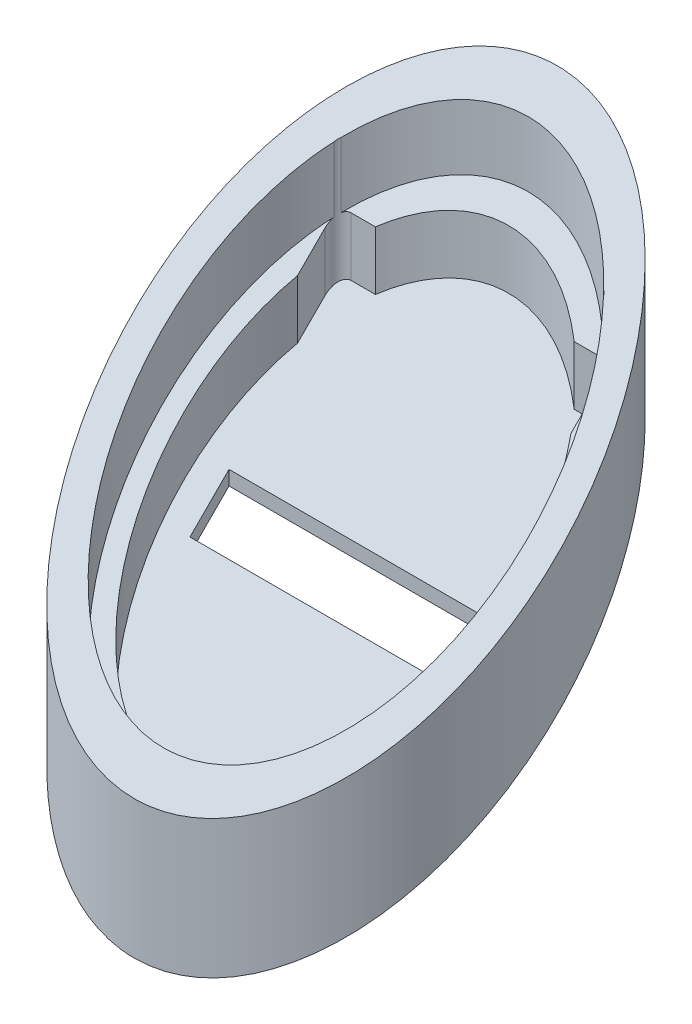
ISO-10303-21;
HEADER;
FILE_DESCRIPTION(('STEP AP214'),'2;1');
FILE_NAME('part.step','',(''),(''),'','','');
FILE_SCHEMA(('AUTOMOTIVE_DESIGN { 1 0 10303 214 1 1 1 1 }'));
ENDSEC;
DATA;
#1=APPLICATION_CONTEXT('core data for automotive mechanical design processes');
#2=APPLICATION_PROTOCOL_DEFINITION('international standard','automotive_design',2000,#1);
#3=PRODUCT_CONTEXT('',#1,'mechanical');
#4=PRODUCT('Part','Part','',(#3));
#5=PRODUCT_RELATED_PRODUCT_CATEGORY('part','',(#4));
#6=PRODUCT_DEFINITION_FORMATION('','',#4);
#7=PRODUCT_DEFINITION_CONTEXT('part definition',#1,'design');
#8=PRODUCT_DEFINITION('design','',#6,#7);
#9=PRODUCT_DEFINITION_SHAPE('','',#8);
#10=(LENGTH_UNIT() NAMED_UNIT(*) SI_UNIT(.MILLI.,.METRE.));
#11=(NAMED_UNIT(*) PLANE_ANGLE_UNIT() SI_UNIT($,.RADIAN.));
#12=(NAMED_UNIT(*) SI_UNIT($,.STERADIAN.) SOLID_ANGLE_UNIT());
#13=UNCERTAINTY_MEASURE_WITH_UNIT(LENGTH_MEASURE(1.E-05),#10,'distance_accuracy_value','');
#14=(GEOMETRIC_REPRESENTATION_CONTEXT(3) GLOBAL_UNCERTAINTY_ASSIGNED_CONTEXT((#13)) GLOBAL_UNIT_ASSIGNED_CONTEXT((#10,
#11,#12)) REPRESENTATION_CONTEXT('',''));
#15=CARTESIAN_POINT('',(0.,0.,0.));
#16=DIRECTION('',(0.,0.,1.));
#17=DIRECTION('',(1.,0.,0.));
#18=AXIS2_PLACEMENT_3D('',#15,#16,#17);
#19=CARTESIAN_POINT('',(-32.5,35.0000000000002,32.5));
#20=DIRECTION('',(0.,-0.707106781186549,-0.707106781186546));
#21=DIRECTION('',(0.,0.707106781186546,-0.707106781186549));
#22=AXIS2_PLACEMENT_3D('',#19,#20,#21);
#23=PLANE('',#22);
#24=CARTESIAN_POINT('',(0.,67.5000000000001,0.));
#25=DIRECTION('',(0.,-0.707106781186549,-0.707106781186546));
#26=DIRECTION('',(0.,-0.707106781186546,0.707106781186549));
#27=AXIS2_PLACEMENT_3D('',#24,#25,#26);
#28=ELLIPSE('',#27,45.9619407771255,32.5);
#29=CARTESIAN_POINT('',(0.,35.0000000000002,32.5));
#30=VERTEX_POINT('',#29);
#31=EDGE_CURVE('E229',#30,#30,#28,.T.);
#32=ORIENTED_EDGE('',*,*,#31,.F.);
#33=EDGE_LOOP('',(#32));
#34=FACE_BOUND('',#33,.T.);
#35=CARTESIAN_POINT('',(0.,39.5000000001092,28.));
#36=CARTESIAN_POINT('',(-56.,39.5000000001092,28.));
#37=CARTESIAN_POINT('',(-56.,95.5000000001091,-28.));
#38=CARTESIAN_POINT('',(0.,95.5000000001091,-28.));
#39=CARTESIAN_POINT('',(56.,95.5000000001091,-28.));
#40=CARTESIAN_POINT('',(56.,39.5000000001092,28.));
#41=CARTESIAN_POINT('',(0.,39.5000000001092,28.));
#42=(BOUNDED_CURVE() B_SPLINE_CURVE(3,(#35,#36,#37,#38,#39,#40,#41),.UNSPECIFIED.,.T.,
.F.) B_SPLINE_CURVE_WITH_KNOTS((4,3,4),(0.,0.5,1.),
.UNSPECIFIED.) CURVE() GEOMETRIC_REPRESENTATION_ITEM() RATIONAL_B_SPLINE_CURVE((1.,
0.333333333333333,0.333333333333333,1.,0.333333333333333,0.333333333333333,1.)) REPRESENTATION_ITEM(''));
#43=CARTESIAN_POINT('',(20.6857783949476,86.3705742413747,-18.8705742412656));
#44=VERTEX_POINT('',#43);
#45=CARTESIAN_POINT('',(-20.6857783949476,86.3705742413747,-18.8705742412657));
#46=VERTEX_POINT('',#45);
#47=EDGE_CURVE('E222',#44,#46,#42,.T.);
#48=ORIENTED_EDGE('',*,*,#47,.T.);
#49=CARTESIAN_POINT('',(-19.,85.2943999044766,-17.7943999044765));
#50=DIRECTION('',(0.,-0.707106781186549,-0.707106781186546));
#51=DIRECTION('',(0.,-0.707106781186546,0.707106781186549));
#52=AXIS2_PLACEMENT_3D('',#49,#50,#51);
#53=ELLIPSE('',#52,2.82842712474619,2.);
#54=CARTESIAN_POINT('',(-20.1842195268922,86.906114554296,-19.4061145541869));
#55=VERTEX_POINT('',#54);
#56=EDGE_CURVE('E269',#46,#55,#53,.T.);
#57=ORIENTED_EDGE('',*,*,#56,.T.);
#58=CARTESIAN_POINT('',(20.1842195268922,86.906114554296,-19.4061145541869));
#59=VERTEX_POINT('',#58);
#60=EDGE_CURVE('E221',#55,#59,#42,.T.);
#61=ORIENTED_EDGE('',*,*,#60,.T.);
#62=CARTESIAN_POINT('',(19.,85.2943999044765,-17.7943999044765));
#63=DIRECTION('',(0.,-0.707106781186549,-0.707106781186546));
#64=DIRECTION('',(0.,-0.707106781186546,0.707106781186549));
#65=AXIS2_PLACEMENT_3D('',#62,#63,#64);
#66=ELLIPSE('',#65,2.82842712474619,2.);
#67=EDGE_CURVE('E255',#59,#44,#66,.T.);
#68=ORIENTED_EDGE('',*,*,#67,.T.);
#69=EDGE_LOOP('',(#48,#57,#61,#68));
#70=FACE_BOUND('',#69,.T.);
#71=ADVANCED_FACE('F34',(#34,#70),#23,.F.);
#72=CARTESIAN_POINT('',(0.,29.5000000001092,0.));
#73=DIRECTION('',(0.,1.,0.));
#74=DIRECTION('',(0.,0.,1.));
#75=AXIS2_PLACEMENT_3D('',#72,#73,#74);
#76=CYLINDRICAL_SURFACE('',#75,28.);
#77=CARTESIAN_POINT('',(0.,29.5000000001092,28.));
#78=CARTESIAN_POINT('',(-56.,29.5000000001092,28.));
#79=CARTESIAN_POINT('',(-56.,85.5000000001091,-28.));
#80=CARTESIAN_POINT('',(0.,85.5000000001091,-28.));
#81=CARTESIAN_POINT('',(56.,85.5000000001091,-28.));
#82=CARTESIAN_POINT('',(56.,29.5000000001092,28.));
#83=CARTESIAN_POINT('',(0.,29.5000000001092,28.));
#84=(BOUNDED_CURVE() B_SPLINE_CURVE(3,(#77,#78,#79,#80,#81,#82,#83),.UNSPECIFIED.,.T.,
.F.) B_SPLINE_CURVE_WITH_KNOTS((4,3,4),(0.,0.5,1.),
.UNSPECIFIED.) CURVE() GEOMETRIC_REPRESENTATION_ITEM() RATIONAL_B_SPLINE_CURVE((1.,
0.333333333333333,0.333333333333333,1.,0.333333333333333,0.333333333333333,1.)) REPRESENTATION_ITEM(''));
#85=CARTESIAN_POINT('',(20.6857783949125,76.3705742414132,-18.8705742413041));
#86=VERTEX_POINT('',#85);
#87=CARTESIAN_POINT('',(-20.6857783949125,76.3705742414132,-18.8705742413042));
#88=VERTEX_POINT('',#87);
#89=EDGE_CURVE('E213',#86,#88,#84,.T.);
#90=ORIENTED_EDGE('',*,*,#89,.T.);
#91=DIRECTION('',(0.,1.,0.));
#92=VECTOR('',#91,1.);
#93=CARTESIAN_POINT('',(-20.6857783949123,76.3705742414134,-18.8705742413043));
#94=LINE('',#93,#92);
#95=EDGE_CURVE('E266',#88,#46,#94,.T.);
#96=ORIENTED_EDGE('',*,*,#95,.T.);
#97=ORIENTED_EDGE('',*,*,#47,.F.);
#98=DIRECTION('',(0.,1.,0.));
#99=VECTOR('',#98,1.);
#100=CARTESIAN_POINT('',(20.6857783949124,86.3705742413043,-18.8705742413043));
#101=LINE('',#100,#99);
#102=EDGE_CURVE('E258',#44,#86,#101,.F.);
#103=ORIENTED_EDGE('',*,*,#102,.T.);
#104=EDGE_LOOP('',(#90,#96,#97,#103));
#105=FACE_BOUND('',#104,.T.);
#106=ADVANCED_FACE('F304',(#105),#76,.F.);
#107=CARTESIAN_POINT('',(-20.1842195268563,76.9061145543333,-19.4061145542242));
#108=VERTEX_POINT('',#107);
#109=CARTESIAN_POINT('',(20.1842195268563,76.9061145543333,-19.4061145542242));
#110=VERTEX_POINT('',#109);
#111=EDGE_CURVE('E220',#108,#110,#84,.T.);
#112=ORIENTED_EDGE('',*,*,#111,.T.);
#113=DIRECTION('',(0.,1.,0.));
#114=VECTOR('',#113,1.);
#115=CARTESIAN_POINT('',(20.1842195268554,76.9061145543342,-19.4061145542251));
#116=LINE('',#115,#114);
#117=EDGE_CURVE('E252',#110,#59,#116,.T.);
#118=ORIENTED_EDGE('',*,*,#117,.T.);
#119=ORIENTED_EDGE('',*,*,#60,.F.);
#120=DIRECTION('',(0.,1.,0.));
#121=VECTOR('',#120,1.);
#122=CARTESIAN_POINT('',(-20.1842195268555,86.9061145542252,-19.4061145542251));
#123=LINE('',#122,#121);
#124=EDGE_CURVE('E272',#55,#108,#123,.F.);
#125=ORIENTED_EDGE('',*,*,#124,.T.);
#126=EDGE_LOOP('',(#112,#118,#119,#125));
#127=FACE_BOUND('',#126,.T.);
#128=ADVANCED_FACE('F310',(#127),#76,.F.);
#129=CARTESIAN_POINT('',(0.,85.5000000001091,-28.));
#130=DIRECTION('',(0.,0.707106781186549,0.707106781186547));
#131=DIRECTION('',(0.,-0.707106781186546,0.707106781186549));
#132=AXIS2_PLACEMENT_3D('',#129,#130,#131);
#133=PLANE('',#132);
#134=CARTESIAN_POINT('',(0.,32.4999999998909,25.));
#135=CARTESIAN_POINT('',(50.,32.4999999998909,25.));
#136=CARTESIAN_POINT('',(50.,82.4999999998908,-25.));
#137=CARTESIAN_POINT('',(0.,82.4999999998908,-25.));
#138=CARTESIAN_POINT('',(-50.,82.4999999998908,-25.));
#139=CARTESIAN_POINT('',(-50.,32.4999999998909,25.));
#140=CARTESIAN_POINT('',(0.,32.4999999998909,25.));
#141=(BOUNDED_CURVE() B_SPLINE_CURVE(3,(#134,#135,#136,#137,#138,#139,#140),.UNSPECIFIED.,.T.,
.F.) B_SPLINE_CURVE_WITH_KNOTS((4,3,4),(0.,0.5,1.),
.UNSPECIFIED.) CURVE() GEOMETRIC_REPRESENTATION_ITEM() RATIONAL_B_SPLINE_CURVE((1.,
0.333333333333333,0.333333333333333,1.,0.333333333333333,0.333333333333333,1.)) REPRESENTATION_ITEM(''));
#142=CARTESIAN_POINT('',(-21.,71.0646599661414,-13.5646599662505));
#143=VERTEX_POINT('',#142);
#144=CARTESIAN_POINT('',(21.,71.0646599661413,-13.5646599662505));
#145=VERTEX_POINT('',#144);
#146=EDGE_CURVE('E205',#143,#145,#141,.T.);
#147=ORIENTED_EDGE('',*,*,#146,.F.);
#148=DIRECTION('',(0.,0.707106781186546,-0.707106781186549));
#149=VECTOR('',#148,1.);
#150=CARTESIAN_POINT('',(-21.,85.5000000001091,-28.));
#151=LINE('',#150,#149);
#152=CARTESIAN_POINT('',(-21.,75.2943999045856,-17.7943999044765));
#153=VERTEX_POINT('',#152);
#154=EDGE_CURVE('E192',#143,#153,#151,.T.);
#155=ORIENTED_EDGE('',*,*,#154,.T.);
#156=CARTESIAN_POINT('',(-19.,75.2943999045856,-17.7943999044765));
#157=DIRECTION('',(0.,0.707106781186549,0.707106781186547));
#158=DIRECTION('',(0.,-0.707106781186546,0.707106781186549));
#159=AXIS2_PLACEMENT_3D('',#156,#157,#158);
#160=ELLIPSE('',#159,2.82842712474619,2.);
#161=EDGE_CURVE('E263',#153,#88,#160,.F.);
#162=ORIENTED_EDGE('',*,*,#161,.T.);
#163=ORIENTED_EDGE('',*,*,#89,.F.);
#164=CARTESIAN_POINT('',(19.,75.2943999045856,-17.7943999044765));
#165=DIRECTION('',(0.,0.707106781186549,0.707106781186547));
#166=DIRECTION('',(0.,-0.707106781186546,0.707106781186549));
#167=AXIS2_PLACEMENT_3D('',#164,#165,#166);
#168=ELLIPSE('',#167,2.82842712474619,2.);
#169=CARTESIAN_POINT('',(21.,75.2943999045856,-17.7943999044765));
#170=VERTEX_POINT('',#169);
#171=EDGE_CURVE('E261',#86,#170,#168,.F.);
#172=ORIENTED_EDGE('',*,*,#171,.T.);
#173=DIRECTION('',(0.,-0.707106781186546,0.707106781186549));
#174=VECTOR('',#173,1.);
#175=CARTESIAN_POINT('',(21.,85.5000000001091,-28.));
#176=LINE('',#175,#174);
#177=EDGE_CURVE('E181',#170,#145,#176,.T.);
#178=ORIENTED_EDGE('',*,*,#177,.T.);
#179=EDGE_LOOP('',(#147,#155,#162,#163,#172,#178));
#180=FACE_BOUND('',#179,.T.);
#181=ADVANCED_FACE('F360',(#180),#133,.T.);
#182=ORIENTED_EDGE('',*,*,#111,.F.);
#183=CARTESIAN_POINT('',(-19.,75.2943999045856,-17.7943999044765));
#184=DIRECTION('',(0.,0.707106781186549,0.707106781186547));
#185=DIRECTION('',(0.,-0.707106781186546,0.707106781186549));
#186=AXIS2_PLACEMENT_3D('',#183,#184,#185);
#187=ELLIPSE('',#186,2.82842712474619,2.);
#188=CARTESIAN_POINT('',(-19.,77.2943999045856,-19.7943999044765));
#189=VERTEX_POINT('',#188);
#190=EDGE_CURVE('E275',#108,#189,#187,.F.);
#191=ORIENTED_EDGE('',*,*,#190,.T.);
#192=DIRECTION('',(1.,0.,0.));
#193=VECTOR('',#192,1.);
#194=CARTESIAN_POINT('',(0.,77.2943999045856,-19.7943999044765));
#195=LINE('',#194,#193);
#196=CARTESIAN_POINT('',(-15.2702892055671,77.2943999043673,-19.7943999044765));
#197=VERTEX_POINT('',#196);
#198=EDGE_CURVE('E186',#189,#197,#195,.T.);
#199=ORIENTED_EDGE('',*,*,#198,.T.);
#200=CARTESIAN_POINT('',(15.2702892055672,77.2943999043673,-19.7943999044765));
#201=VERTEX_POINT('',#200);
#202=EDGE_CURVE('E195',#201,#197,#141,.T.);
#203=ORIENTED_EDGE('',*,*,#202,.F.);
#204=CARTESIAN_POINT('',(19.,77.2943999045856,-19.7943999044765));
#205=VERTEX_POINT('',#204);
#206=EDGE_CURVE('E189',#201,#205,#195,.T.);
#207=ORIENTED_EDGE('',*,*,#206,.T.);
#208=CARTESIAN_POINT('',(19.,75.2943999045856,-17.7943999044765));
#209=DIRECTION('',(0.,0.707106781186549,0.707106781186547));
#210=DIRECTION('',(0.,-0.707106781186546,0.707106781186549));
#211=AXIS2_PLACEMENT_3D('',#208,#209,#210);
#212=ELLIPSE('',#211,2.82842712474619,2.);
#213=EDGE_CURVE('E249',#205,#110,#212,.F.);
#214=ORIENTED_EDGE('',*,*,#213,.T.);
#215=EDGE_LOOP('',(#182,#191,#199,#203,#207,#214));
#216=FACE_BOUND('',#215,.T.);
#217=ADVANCED_FACE('F379',(#216),#133,.T.);
#218=CARTESIAN_POINT('',(0.,23.4999999998909,0.));
#219=DIRECTION('',(0.,1.,0.));
#220=DIRECTION('',(0.,0.,1.));
#221=AXIS2_PLACEMENT_3D('',#218,#219,#220);
#222=CYLINDRICAL_SURFACE('',#221,25.);
#223=DIRECTION('',(0.,1.,0.));
#224=VECTOR('',#223,1.);
#225=CARTESIAN_POINT('',(15.2702892055672,23.4999999998909,-19.7943999044765));
#226=LINE('',#225,#224);
#227=CARTESIAN_POINT('',(15.2702892055672,68.2943999043673,-19.7943999044765));
#228=VERTEX_POINT('',#227);
#229=EDGE_CURVE('E188',#201,#228,#226,.F.);
#230=ORIENTED_EDGE('',*,*,#229,.F.);
#231=ORIENTED_EDGE('',*,*,#202,.T.);
#232=DIRECTION('',(0.,1.,0.));
#233=VECTOR('',#232,1.);
#234=CARTESIAN_POINT('',(-15.2702892055671,23.4999999998909,-19.7943999044765));
#235=LINE('',#234,#233);
#236=CARTESIAN_POINT('',(-15.2702892055672,68.2943999044765,-19.7943999044765));
#237=VERTEX_POINT('',#236);
#238=EDGE_CURVE('E183',#237,#197,#235,.T.);
#239=ORIENTED_EDGE('',*,*,#238,.F.);
#240=CARTESIAN_POINT('',(0.,23.4999999998909,25.));
#241=CARTESIAN_POINT('',(50.,23.4999999998909,25.));
#242=CARTESIAN_POINT('',(50.,73.4999999998908,-25.));
#243=CARTESIAN_POINT('',(0.,73.4999999998908,-25.));
#244=CARTESIAN_POINT('',(-50.,73.4999999998908,-25.));
#245=CARTESIAN_POINT('',(-50.,23.4999999998909,25.));
#246=CARTESIAN_POINT('',(0.,23.4999999998909,25.));
#247=(BOUNDED_CURVE() B_SPLINE_CURVE(3,(#240,#241,#242,#243,#244,#245,#246),.UNSPECIFIED.,.T.,
.F.) B_SPLINE_CURVE_WITH_KNOTS((4,3,4),(0.,0.5,1.),
.UNSPECIFIED.) CURVE() GEOMETRIC_REPRESENTATION_ITEM() RATIONAL_B_SPLINE_CURVE((1.,
0.333333333333333,0.333333333333333,1.,0.333333333333333,0.333333333333333,1.)) REPRESENTATION_ITEM(''));
#248=EDGE_CURVE('E199',#228,#237,#247,.T.);
#249=ORIENTED_EDGE('',*,*,#248,.F.);
#250=EDGE_LOOP('',(#230,#231,#239,#249));
#251=FACE_BOUND('',#250,.T.);
#252=ADVANCED_FACE('F348',(#251),#222,.F.);
#253=CARTESIAN_POINT('',(-21.,62.0646599661414,-13.5646599662506));
#254=VERTEX_POINT('',#253);
#255=CARTESIAN_POINT('',(21.,62.064659966196,-13.5646599661959));
#256=VERTEX_POINT('',#255);
#257=EDGE_CURVE('E204',#254,#256,#247,.T.);
#258=ORIENTED_EDGE('',*,*,#257,.F.);
#259=DIRECTION('',(0.,1.,0.));
#260=VECTOR('',#259,1.);
#261=CARTESIAN_POINT('',(-21.,23.4999999998909,-13.5646599662505));
#262=LINE('',#261,#260);
#263=EDGE_CURVE('E196',#143,#254,#262,.F.);
#264=ORIENTED_EDGE('',*,*,#263,.F.);
#265=ORIENTED_EDGE('',*,*,#146,.T.);
#266=DIRECTION('',(0.,1.,0.));
#267=VECTOR('',#266,1.);
#268=CARTESIAN_POINT('',(21.,23.4999999998909,-13.5646599662505));
#269=LINE('',#268,#267);
#270=EDGE_CURVE('E178',#256,#145,#269,.T.);
#271=ORIENTED_EDGE('',*,*,#270,.F.);
#272=EDGE_LOOP('',(#258,#264,#265,#271));
#273=FACE_BOUND('',#272,.T.);
#274=ADVANCED_FACE('F319',(#273),#222,.F.);
#275=CARTESIAN_POINT('',(0.,100.,0.));
#276=DIRECTION('',(0.,-1.,0.));
#277=DIRECTION('',(0.,0.,-1.));
#278=AXIS2_PLACEMENT_3D('',#275,#276,#277);
#279=CYLINDRICAL_SURFACE('',#278,32.5);
#280=CARTESIAN_POINT('',(0.,46.2867965644036,0.));
#281=DIRECTION('',(0.,0.707106781186547,0.707106781186548));
#282=DIRECTION('',(0.,-0.707106781186548,0.707106781186547));
#283=AXIS2_PLACEMENT_3D('',#280,#281,#282);
#284=ELLIPSE('',#283,45.9619407771256,32.5);
#285=CARTESIAN_POINT('',(0.,13.7867965644036,32.5));
#286=VERTEX_POINT('',#285);
#287=EDGE_CURVE('E157',#286,#286,#284,.T.);
#288=ORIENTED_EDGE('',*,*,#287,.T.);
#289=EDGE_LOOP('',(#288));
#290=FACE_BOUND('',#289,.T.);
#291=ORIENTED_EDGE('',*,*,#31,.T.);
#292=EDGE_LOOP('',(#291));
#293=FACE_BOUND('',#292,.T.);
#294=ADVANCED_FACE('F317',(#290,#293),#279,.T.);
#295=CARTESIAN_POINT('',(0.,73.4999999998908,-25.));
#296=DIRECTION('',(0.,-0.707106781186549,-0.707106781186547));
#297=DIRECTION('',(0.,0.707106781186547,-0.707106781186549));
#298=AXIS2_PLACEMENT_3D('',#295,#296,#297);
#299=PLANE('',#298);
#300=DIRECTION('',(-1.,0.,0.));
#301=VECTOR('',#300,1.);
#302=CARTESIAN_POINT('',(0.,45.0443999043674,3.4556000955235));
#303=LINE('',#302,#301);
#304=CARTESIAN_POINT('',(20.5,45.0443999043674,3.45560009552351));
#305=VERTEX_POINT('',#304);
#306=CARTESIAN_POINT('',(-20.5,45.0443999043674,3.4556000955235));
#307=VERTEX_POINT('',#306);
#308=EDGE_CURVE('E281',#305,#307,#303,.T.);
#309=ORIENTED_EDGE('',*,*,#308,.T.);
#310=DIRECTION('',(0.,0.707106781186547,-0.707106781186549));
#311=VECTOR('',#310,1.);
#312=CARTESIAN_POINT('',(-20.5,73.4999999998908,-25.));
#313=LINE('',#312,#311);
#314=CARTESIAN_POINT('',(-20.5,51.0443999043673,-2.5443999044765));
#315=VERTEX_POINT('',#314);
#316=EDGE_CURVE('E42',#307,#315,#313,.T.);
#317=ORIENTED_EDGE('',*,*,#316,.T.);
#318=DIRECTION('',(1.,0.,0.));
#319=VECTOR('',#318,1.);
#320=CARTESIAN_POINT('',(0.,51.0443999043673,-2.54439990447649));
#321=LINE('',#320,#319);
#322=CARTESIAN_POINT('',(20.5,51.0443999043673,-2.54439990447649));
#323=VERTEX_POINT('',#322);
#324=EDGE_CURVE('E162',#315,#323,#321,.T.);
#325=ORIENTED_EDGE('',*,*,#324,.T.);
#326=DIRECTION('',(0.,-0.707106781186547,0.707106781186549));
#327=VECTOR('',#326,1.);
#328=CARTESIAN_POINT('',(20.5,73.4999999998908,-25.));
#329=LINE('',#328,#327);
#330=EDGE_CURVE('E278',#323,#305,#329,.T.);
#331=ORIENTED_EDGE('',*,*,#330,.T.);
#332=EDGE_LOOP('',(#309,#317,#325,#331));
#333=FACE_BOUND('',#332,.T.);
#334=DIRECTION('',(0.,-0.707106781186546,0.707106781186549));
#335=VECTOR('',#334,1.);
#336=CARTESIAN_POINT('',(21.,16.0000000000002,32.5));
#337=LINE('',#336,#335);
#338=CARTESIAN_POINT('',(21.,66.2943999044765,-17.7943999044765));
#339=VERTEX_POINT('',#338);
#340=EDGE_CURVE('E176',#339,#256,#337,.T.);
#341=ORIENTED_EDGE('',*,*,#340,.F.);
#342=CARTESIAN_POINT('',(19.,66.2943999043673,-17.7943999044765));
#343=DIRECTION('',(0.,-0.707106781186549,-0.707106781186547));
#344=DIRECTION('',(0.,-0.707106781186547,0.707106781186549));
#345=AXIS2_PLACEMENT_3D('',#342,#343,#344);
#346=ELLIPSE('',#345,2.82842712474619,2.);
#347=CARTESIAN_POINT('',(19.,68.2943999044765,-19.7943999044765));
#348=VERTEX_POINT('',#347);
#349=EDGE_CURVE('E242',#339,#348,#346,.F.);
#350=ORIENTED_EDGE('',*,*,#349,.T.);
#351=DIRECTION('',(1.,0.,0.));
#352=VECTOR('',#351,1.);
#353=CARTESIAN_POINT('',(-32.5,68.2943999044765,-19.7943999044765));
#354=LINE('',#353,#352);
#355=EDGE_CURVE('E173',#228,#348,#354,.T.);
#356=ORIENTED_EDGE('',*,*,#355,.F.);
#357=ORIENTED_EDGE('',*,*,#248,.T.);
#358=CARTESIAN_POINT('',(-19.,68.2943999044765,-19.7943999044765));
#359=VERTEX_POINT('',#358);
#360=EDGE_CURVE('E174',#359,#237,#354,.T.);
#361=ORIENTED_EDGE('',*,*,#360,.F.);
#362=CARTESIAN_POINT('',(-19.,66.2943999043673,-17.7943999044765));
#363=DIRECTION('',(0.,-0.707106781186549,-0.707106781186547));
#364=DIRECTION('',(0.,-0.707106781186547,0.707106781186549));
#365=AXIS2_PLACEMENT_3D('',#362,#363,#364);
#366=ELLIPSE('',#365,2.82842712474619,2.);
#367=CARTESIAN_POINT('',(-21.,66.2943999044765,-17.7943999044765));
#368=VERTEX_POINT('',#367);
#369=EDGE_CURVE('E240',#359,#368,#366,.F.);
#370=ORIENTED_EDGE('',*,*,#369,.T.);
#371=DIRECTION('',(0.,0.707106781186546,-0.707106781186549));
#372=VECTOR('',#371,1.);
#373=CARTESIAN_POINT('',(-21.,16.0000000000002,32.5));
#374=LINE('',#373,#372);
#375=EDGE_CURVE('E170',#254,#368,#374,.T.);
#376=ORIENTED_EDGE('',*,*,#375,.F.);
#377=ORIENTED_EDGE('',*,*,#257,.T.);
#378=EDGE_LOOP('',(#341,#350,#356,#357,#361,#370,#376,#377));
#379=FACE_BOUND('',#378,.T.);
#380=ADVANCED_FACE('F284',(#333,#379),#299,.F.);
#381=CARTESIAN_POINT('',(21.,16.0000000000002,32.5));
#382=DIRECTION('',(-1.,0.,0.));
#383=DIRECTION('',(0.,0.,1.));
#384=AXIS2_PLACEMENT_3D('',#381,#382,#383);
#385=PLANE('',#384);
#386=ORIENTED_EDGE('',*,*,#177,.F.);
#387=DIRECTION('',(0.,1.,0.));
#388=VECTOR('',#387,1.);
#389=CARTESIAN_POINT('',(21.,68.2943999044765,-17.7943999044765));
#390=LINE('',#389,#388);
#391=EDGE_CURVE('E238',#170,#339,#390,.F.);
#392=ORIENTED_EDGE('',*,*,#391,.T.);
#393=ORIENTED_EDGE('',*,*,#340,.T.);
#394=ORIENTED_EDGE('',*,*,#270,.T.);
#395=EDGE_LOOP('',(#386,#392,#393,#394));
#396=FACE_BOUND('',#395,.T.);
#397=ADVANCED_FACE('F366',(#396),#385,.T.);
#398=CARTESIAN_POINT('',(-32.5,68.2943999044765,-19.7943999044765));
#399=DIRECTION('',(0.,0.,1.));
#400=DIRECTION('',(1.,0.,0.));
#401=AXIS2_PLACEMENT_3D('',#398,#399,#400);
#402=PLANE('',#401);
#403=ORIENTED_EDGE('',*,*,#355,.T.);
#404=DIRECTION('',(0.,1.,0.));
#405=VECTOR('',#404,1.);
#406=CARTESIAN_POINT('',(19.,87.2943999044765,-19.7943999044765));
#407=LINE('',#406,#405);
#408=EDGE_CURVE('E235',#348,#205,#407,.T.);
#409=ORIENTED_EDGE('',*,*,#408,.T.);
#410=ORIENTED_EDGE('',*,*,#206,.F.);
#411=ORIENTED_EDGE('',*,*,#229,.T.);
#412=EDGE_LOOP('',(#403,#409,#410,#411));
#413=FACE_BOUND('',#412,.T.);
#414=ADVANCED_FACE('F333',(#413),#402,.T.);
#415=CARTESIAN_POINT('',(-21.,16.0000000000002,32.5));
#416=DIRECTION('',(1.,0.,0.));
#417=DIRECTION('',(0.,0.,-1.));
#418=AXIS2_PLACEMENT_3D('',#415,#416,#417);
#419=PLANE('',#418);
#420=ORIENTED_EDGE('',*,*,#375,.T.);
#421=DIRECTION('',(0.,1.,0.));
#422=VECTOR('',#421,1.);
#423=CARTESIAN_POINT('',(-21.,87.2943999044766,-17.7943999044765));
#424=LINE('',#423,#422);
#425=EDGE_CURVE('E244',#368,#153,#424,.T.);
#426=ORIENTED_EDGE('',*,*,#425,.T.);
#427=ORIENTED_EDGE('',*,*,#154,.F.);
#428=ORIENTED_EDGE('',*,*,#263,.T.);
#429=EDGE_LOOP('',(#420,#426,#427,#428));
#430=FACE_BOUND('',#429,.T.);
#431=ADVANCED_FACE('F330',(#430),#419,.T.);
#432=ORIENTED_EDGE('',*,*,#198,.F.);
#433=DIRECTION('',(0.,1.,0.));
#434=VECTOR('',#433,1.);
#435=CARTESIAN_POINT('',(-19.,68.2943999044765,-19.7943999044765));
#436=LINE('',#435,#434);
#437=EDGE_CURVE('E247',#189,#359,#436,.F.);
#438=ORIENTED_EDGE('',*,*,#437,.T.);
#439=ORIENTED_EDGE('',*,*,#360,.T.);
#440=ORIENTED_EDGE('',*,*,#238,.T.);
#441=EDGE_LOOP('',(#432,#438,#439,#440));
#442=FACE_BOUND('',#441,.T.);
#443=ADVANCED_FACE('F323',(#442),#402,.T.);
#444=CARTESIAN_POINT('',(19.,68.2943999044765,-17.7943999044765));
#445=DIRECTION('',(0.,-1.,0.));
#446=DIRECTION('',(0.,0.,-1.));
#447=AXIS2_PLACEMENT_3D('',#444,#445,#446);
#448=CYLINDRICAL_SURFACE('',#447,2.);
#449=ORIENTED_EDGE('',*,*,#349,.F.);
#450=ORIENTED_EDGE('',*,*,#391,.F.);
#451=ORIENTED_EDGE('',*,*,#171,.F.);
#452=ORIENTED_EDGE('',*,*,#102,.F.);
#453=ORIENTED_EDGE('',*,*,#67,.F.);
#454=ORIENTED_EDGE('',*,*,#117,.F.);
#455=ORIENTED_EDGE('',*,*,#213,.F.);
#456=ORIENTED_EDGE('',*,*,#408,.F.);
#457=EDGE_LOOP('',(#449,#450,#451,#452,#453,#454,#455,#456));
#458=FACE_BOUND('',#457,.T.);
#459=ADVANCED_FACE('F321',(#458),#448,.F.);
#460=CARTESIAN_POINT('',(-19.,16.0000000000002,-17.7943999044765));
#461=DIRECTION('',(0.,-1.,0.));
#462=DIRECTION('',(0.,0.,-1.));
#463=AXIS2_PLACEMENT_3D('',#460,#461,#462);
#464=CYLINDRICAL_SURFACE('',#463,2.);
#465=ORIENTED_EDGE('',*,*,#369,.F.);
#466=ORIENTED_EDGE('',*,*,#437,.F.);
#467=ORIENTED_EDGE('',*,*,#190,.F.);
#468=ORIENTED_EDGE('',*,*,#124,.F.);
#469=ORIENTED_EDGE('',*,*,#56,.F.);
#470=ORIENTED_EDGE('',*,*,#95,.F.);
#471=ORIENTED_EDGE('',*,*,#161,.F.);
#472=ORIENTED_EDGE('',*,*,#425,.F.);
#473=EDGE_LOOP('',(#465,#466,#467,#468,#469,#470,#471,#472));
#474=FACE_BOUND('',#473,.T.);
#475=ADVANCED_FACE('F36',(#474),#464,.F.);
#476=CARTESIAN_POINT('',(-20.5,100.,3.4556000955235));
#477=DIRECTION('',(-1.,0.,0.));
#478=DIRECTION('',(0.,0.,1.));
#479=AXIS2_PLACEMENT_3D('',#476,#477,#478);
#480=PLANE('',#479);
#481=DIRECTION('',(0.,-1.,0.));
#482=VECTOR('',#481,1.);
#483=CARTESIAN_POINT('',(-20.5,100.,3.4556000955235));
#484=LINE('',#483,#482);
#485=CARTESIAN_POINT('',(-20.5,42.8311964688801,3.4556000955235));
#486=VERTEX_POINT('',#485);
#487=EDGE_CURVE('E156',#307,#486,#484,.T.);
#488=ORIENTED_EDGE('',*,*,#487,.T.);
#489=DIRECTION('',(0.,0.707106781186548,-0.707106781186547));
#490=VECTOR('',#489,1.);
#491=CARTESIAN_POINT('',(-20.5,71.4155982344401,-25.1288016700364));
#492=LINE('',#491,#490);
#493=CARTESIAN_POINT('',(-20.5,48.8311964688801,-2.5443999044765));
#494=VERTEX_POINT('',#493);
#495=EDGE_CURVE('E146',#486,#494,#492,.T.);
#496=ORIENTED_EDGE('',*,*,#495,.T.);
#497=DIRECTION('',(0.,-1.,0.));
#498=VECTOR('',#497,1.);
#499=CARTESIAN_POINT('',(-20.5,100.,-2.5443999044765));
#500=LINE('',#499,#498);
#501=EDGE_CURVE('E153',#315,#494,#500,.T.);
#502=ORIENTED_EDGE('',*,*,#501,.F.);
#503=ORIENTED_EDGE('',*,*,#316,.F.);
#504=EDGE_LOOP('',(#488,#496,#502,#503));
#505=FACE_BOUND('',#504,.T.);
#506=ADVANCED_FACE('F152',(#505),#480,.F.);
#507=CARTESIAN_POINT('',(-20.5,100.,3.4556000955235));
#508=DIRECTION('',(0.,0.,1.));
#509=DIRECTION('',(1.,0.,0.));
#510=AXIS2_PLACEMENT_3D('',#507,#508,#509);
#511=PLANE('',#510);
#512=DIRECTION('',(0.,-1.,0.));
#513=VECTOR('',#512,1.);
#514=CARTESIAN_POINT('',(20.5,100.,3.4556000955235));
#515=LINE('',#514,#513);
#516=CARTESIAN_POINT('',(20.5,42.8311964688801,3.4556000955235));
#517=VERTEX_POINT('',#516);
#518=EDGE_CURVE('E164',#305,#517,#515,.T.);
#519=ORIENTED_EDGE('',*,*,#518,.T.);
#520=DIRECTION('',(-1.,0.,0.));
#521=VECTOR('',#520,1.);
#522=CARTESIAN_POINT('',(-20.5,42.8311964688801,3.4556000955235));
#523=LINE('',#522,#521);
#524=EDGE_CURVE('E158',#517,#486,#523,.T.);
#525=ORIENTED_EDGE('',*,*,#524,.T.);
#526=ORIENTED_EDGE('',*,*,#487,.F.);
#527=ORIENTED_EDGE('',*,*,#308,.F.);
#528=EDGE_LOOP('',(#519,#525,#526,#527));
#529=FACE_BOUND('',#528,.T.);
#530=ADVANCED_FACE('F288',(#529),#511,.F.);
#531=CARTESIAN_POINT('',(20.5,100.,3.4556000955235));
#532=DIRECTION('',(1.,0.,0.));
#533=DIRECTION('',(0.,0.,-1.));
#534=AXIS2_PLACEMENT_3D('',#531,#532,#533);
#535=PLANE('',#534);
#536=DIRECTION('',(0.,-1.,0.));
#537=VECTOR('',#536,1.);
#538=CARTESIAN_POINT('',(20.5,100.,-2.5443999044765));
#539=LINE('',#538,#537);
#540=CARTESIAN_POINT('',(20.5,48.8311964688801,-2.5443999044765));
#541=VERTEX_POINT('',#540);
#542=EDGE_CURVE('E55',#323,#541,#539,.T.);
#543=ORIENTED_EDGE('',*,*,#542,.T.);
#544=DIRECTION('',(0.,-0.707106781186548,0.707106781186547));
#545=VECTOR('',#544,1.);
#546=CARTESIAN_POINT('',(20.5,71.4155982344401,-25.1288016700364));
#547=LINE('',#546,#545);
#548=EDGE_CURVE('E49',#541,#517,#547,.T.);
#549=ORIENTED_EDGE('',*,*,#548,.T.);
#550=ORIENTED_EDGE('',*,*,#518,.F.);
#551=ORIENTED_EDGE('',*,*,#330,.F.);
#552=EDGE_LOOP('',(#543,#549,#550,#551));
#553=FACE_BOUND('',#552,.T.);
#554=ADVANCED_FACE('F294',(#553),#535,.F.);
#555=CARTESIAN_POINT('',(-20.5,100.,-2.5443999044765));
#556=DIRECTION('',(0.,0.,-1.));
#557=DIRECTION('',(-1.,0.,0.));
#558=AXIS2_PLACEMENT_3D('',#555,#556,#557);
#559=PLANE('',#558);
#560=ORIENTED_EDGE('',*,*,#501,.T.);
#561=DIRECTION('',(1.,0.,0.));
#562=VECTOR('',#561,1.);
#563=CARTESIAN_POINT('',(-20.5,48.8311964688801,-2.5443999044765));
#564=LINE('',#563,#562);
#565=EDGE_CURVE('E12',#494,#541,#564,.T.);
#566=ORIENTED_EDGE('',*,*,#565,.T.);
#567=ORIENTED_EDGE('',*,*,#542,.F.);
#568=ORIENTED_EDGE('',*,*,#324,.F.);
#569=EDGE_LOOP('',(#560,#566,#567,#568));
#570=FACE_BOUND('',#569,.T.);
#571=ADVANCED_FACE('F160',(#570),#559,.F.);
#572=CARTESIAN_POINT('',(-32.5,13.7867965644036,32.5));
#573=DIRECTION('',(0.,0.707106781186547,0.707106781186548));
#574=DIRECTION('',(0.,-0.707106781186548,0.707106781186547));
#575=AXIS2_PLACEMENT_3D('',#572,#573,#574);
#576=PLANE('',#575);
#577=ORIENTED_EDGE('',*,*,#524,.F.);
#578=ORIENTED_EDGE('',*,*,#548,.F.);
#579=ORIENTED_EDGE('',*,*,#565,.F.);
#580=ORIENTED_EDGE('',*,*,#495,.F.);
#581=EDGE_LOOP('',(#577,#578,#579,#580));
#582=FACE_BOUND('',#581,.T.);
#583=ORIENTED_EDGE('',*,*,#287,.F.);
#584=EDGE_LOOP('',(#583));
#585=FACE_BOUND('',#584,.T.);
#586=ADVANCED_FACE('F144',(#582,#585),#576,.F.);
#587=CLOSED_SHELL('',(#71,#106,#128,#181,#217,#252,#274,#294,#380,#397,#414,#431,#443,#459,#475,
#506,#530,#554,#571,#586));
#588=MANIFOLD_SOLID_BREP('B2',#587);
#589=ADVANCED_BREP_SHAPE_REPRESENTATION('',(#18,#588),#14);
#590=SHAPE_DEFINITION_REPRESENTATION(#9,#589);
ENDSEC;
END-ISO-10303-21;
